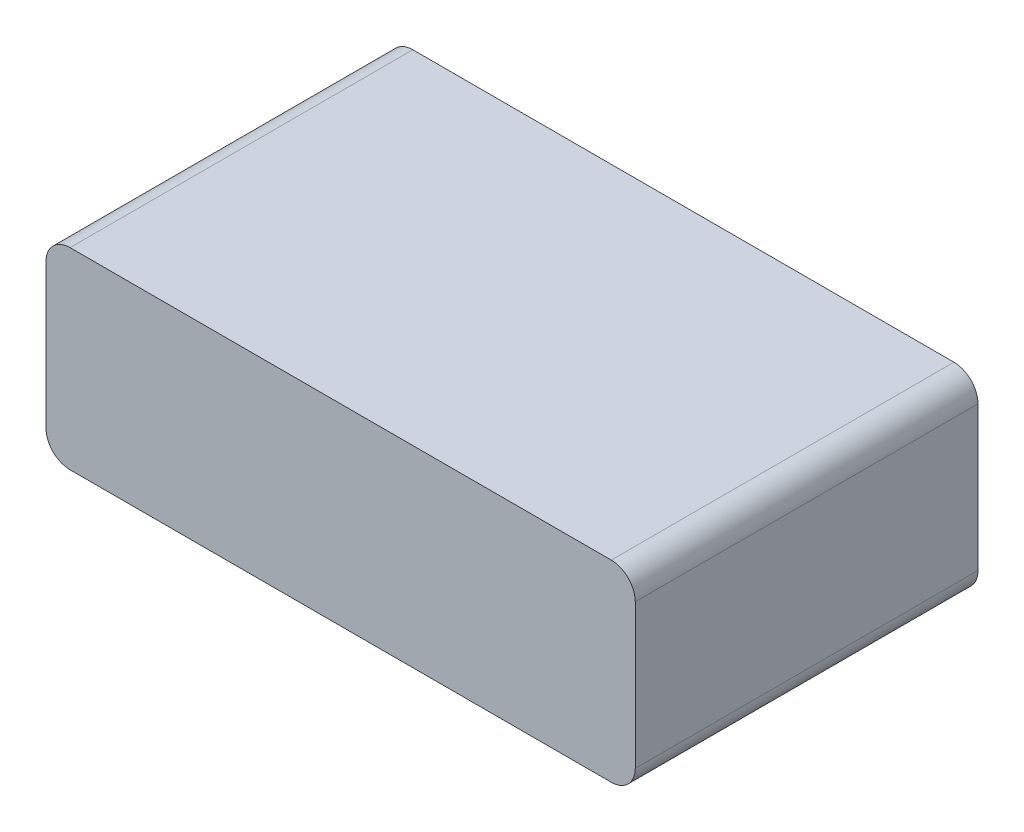
ISO-10303-21;
HEADER;
FILE_DESCRIPTION(('STEP AP214'),'2;1');
FILE_NAME('part.step','',(''),(''),'','','');
FILE_SCHEMA(('AUTOMOTIVE_DESIGN { 1 0 10303 214 1 1 1 1 }'));
ENDSEC;
DATA;
#1=APPLICATION_CONTEXT('core data for automotive mechanical design processes');
#2=APPLICATION_PROTOCOL_DEFINITION('international standard','automotive_design',2000,#1);
#3=PRODUCT_CONTEXT('',#1,'mechanical');
#4=PRODUCT('Part','Part','',(#3));
#5=PRODUCT_RELATED_PRODUCT_CATEGORY('part','',(#4));
#6=PRODUCT_DEFINITION_FORMATION('','',#4);
#7=PRODUCT_DEFINITION_CONTEXT('part definition',#1,'design');
#8=PRODUCT_DEFINITION('design','',#6,#7);
#9=PRODUCT_DEFINITION_SHAPE('','',#8);
#10=(LENGTH_UNIT() NAMED_UNIT(*) SI_UNIT(.MILLI.,.METRE.));
#11=(NAMED_UNIT(*) PLANE_ANGLE_UNIT() SI_UNIT($,.RADIAN.));
#12=(NAMED_UNIT(*) SI_UNIT($,.STERADIAN.) SOLID_ANGLE_UNIT());
#13=UNCERTAINTY_MEASURE_WITH_UNIT(LENGTH_MEASURE(1.E-05),#10,'distance_accuracy_value','');
#14=(GEOMETRIC_REPRESENTATION_CONTEXT(3) GLOBAL_UNCERTAINTY_ASSIGNED_CONTEXT((#13)) GLOBAL_UNIT_ASSIGNED_CONTEXT((#10,
#11,#12)) REPRESENTATION_CONTEXT('',''));
#15=CARTESIAN_POINT('',(0.,0.,0.));
#16=DIRECTION('',(0.,0.,1.));
#17=DIRECTION('',(1.,0.,0.));
#18=AXIS2_PLACEMENT_3D('',#15,#16,#17);
#19=CARTESIAN_POINT('',(0.,16.,0.));
#20=DIRECTION('',(1.,0.,0.));
#21=DIRECTION('',(0.,0.,-1.));
#22=AXIS2_PLACEMENT_3D('',#19,#20,#21);
#23=PLANE('',#22);
#24=DIRECTION('',(0.,-1.,0.));
#25=VECTOR('',#24,1.);
#26=CARTESIAN_POINT('',(0.,16.,-28.5));
#27=LINE('',#26,#25);
#28=CARTESIAN_POINT('',(0.,14.,-28.5));
#29=VERTEX_POINT('',#28);
#30=CARTESIAN_POINT('',(0.,2.,-28.5));
#31=VERTEX_POINT('',#30);
#32=EDGE_CURVE('E121',#29,#31,#27,.T.);
#33=ORIENTED_EDGE('',*,*,#32,.T.);
#34=DIRECTION('',(0.,0.,1.));
#35=VECTOR('',#34,1.);
#36=CARTESIAN_POINT('',(0.,2.,0.));
#37=LINE('',#36,#35);
#38=CARTESIAN_POINT('',(0.,2.,0.));
#39=VERTEX_POINT('',#38);
#40=EDGE_CURVE('E11',#31,#39,#37,.T.);
#41=ORIENTED_EDGE('',*,*,#40,.T.);
#42=DIRECTION('',(0.,-1.,0.));
#43=VECTOR('',#42,1.);
#44=CARTESIAN_POINT('',(0.,16.,0.));
#45=LINE('',#44,#43);
#46=CARTESIAN_POINT('',(0.,14.,0.));
#47=VERTEX_POINT('',#46);
#48=EDGE_CURVE('E126',#47,#39,#45,.T.);
#49=ORIENTED_EDGE('',*,*,#48,.F.);
#50=DIRECTION('',(0.,0.,1.));
#51=VECTOR('',#50,1.);
#52=CARTESIAN_POINT('',(0.,14.,0.));
#53=LINE('',#52,#51);
#54=EDGE_CURVE('E41',#47,#29,#53,.F.);
#55=ORIENTED_EDGE('',*,*,#54,.T.);
#56=EDGE_LOOP('',(#33,#41,#49,#55));
#57=FACE_BOUND('',#56,.T.);
#58=ADVANCED_FACE('F33',(#57),#23,.F.);
#59=CARTESIAN_POINT('',(0.,16.,0.));
#60=DIRECTION('',(0.,0.,-1.));
#61=DIRECTION('',(-1.,0.,0.));
#62=AXIS2_PLACEMENT_3D('',#59,#60,#61);
#63=PLANE('',#62);
#64=DIRECTION('',(1.,0.,0.));
#65=VECTOR('',#64,1.);
#66=CARTESIAN_POINT('',(0.,0.,0.));
#67=LINE('',#66,#65);
#68=CARTESIAN_POINT('',(2.,0.,0.));
#69=VERTEX_POINT('',#68);
#70=CARTESIAN_POINT('',(47.,0.,0.));
#71=VERTEX_POINT('',#70);
#72=EDGE_CURVE('E168',#69,#71,#67,.T.);
#73=ORIENTED_EDGE('',*,*,#72,.T.);
#74=CARTESIAN_POINT('',(47.,2.,0.));
#75=DIRECTION('',(0.,0.,-1.));
#76=DIRECTION('',(-1.,0.,0.));
#77=AXIS2_PLACEMENT_3D('',#74,#75,#76);
#78=CIRCLE('',#77,2.);
#79=CARTESIAN_POINT('',(49.,2.,0.));
#80=VERTEX_POINT('',#79);
#81=EDGE_CURVE('E143',#71,#80,#78,.F.);
#82=ORIENTED_EDGE('',*,*,#81,.T.);
#83=DIRECTION('',(0.,-1.,0.));
#84=VECTOR('',#83,1.);
#85=CARTESIAN_POINT('',(49.,16.,0.));
#86=LINE('',#85,#84);
#87=CARTESIAN_POINT('',(49.,14.,0.));
#88=VERTEX_POINT('',#87);
#89=EDGE_CURVE('E120',#88,#80,#86,.T.);
#90=ORIENTED_EDGE('',*,*,#89,.F.);
#91=CARTESIAN_POINT('',(47.,14.,0.));
#92=DIRECTION('',(0.,0.,-1.));
#93=DIRECTION('',(-1.,0.,0.));
#94=AXIS2_PLACEMENT_3D('',#91,#92,#93);
#95=CIRCLE('',#94,2.);
#96=CARTESIAN_POINT('',(47.,16.,0.));
#97=VERTEX_POINT('',#96);
#98=EDGE_CURVE('E125',#88,#97,#95,.F.);
#99=ORIENTED_EDGE('',*,*,#98,.T.);
#100=DIRECTION('',(1.,0.,0.));
#101=VECTOR('',#100,1.);
#102=CARTESIAN_POINT('',(0.,16.,0.));
#103=LINE('',#102,#101);
#104=CARTESIAN_POINT('',(2.,16.,0.));
#105=VERTEX_POINT('',#104);
#106=EDGE_CURVE('E162',#105,#97,#103,.T.);
#107=ORIENTED_EDGE('',*,*,#106,.F.);
#108=CARTESIAN_POINT('',(2.,14.,0.));
#109=DIRECTION('',(0.,0.,-1.));
#110=DIRECTION('',(-1.,0.,0.));
#111=AXIS2_PLACEMENT_3D('',#108,#109,#110);
#112=CIRCLE('',#111,2.);
#113=EDGE_CURVE('E55',#105,#47,#112,.F.);
#114=ORIENTED_EDGE('',*,*,#113,.T.);
#115=ORIENTED_EDGE('',*,*,#48,.T.);
#116=CARTESIAN_POINT('',(2.,2.,0.));
#117=DIRECTION('',(0.,0.,-1.));
#118=DIRECTION('',(-1.,0.,0.));
#119=AXIS2_PLACEMENT_3D('',#116,#117,#118);
#120=CIRCLE('',#119,2.);
#121=EDGE_CURVE('E48',#39,#69,#120,.F.);
#122=ORIENTED_EDGE('',*,*,#121,.T.);
#123=EDGE_LOOP('',(#73,#82,#90,#99,#107,#114,#115,#122));
#124=FACE_BOUND('',#123,.T.);
#125=ADVANCED_FACE('F164',(#124),#63,.F.);
#126=CARTESIAN_POINT('',(49.,16.,0.));
#127=DIRECTION('',(-1.,0.,0.));
#128=DIRECTION('',(0.,0.,1.));
#129=AXIS2_PLACEMENT_3D('',#126,#127,#128);
#130=PLANE('',#129);
#131=ORIENTED_EDGE('',*,*,#89,.T.);
#132=DIRECTION('',(0.,0.,-1.));
#133=VECTOR('',#132,1.);
#134=CARTESIAN_POINT('',(49.,2.,-28.5));
#135=LINE('',#134,#133);
#136=CARTESIAN_POINT('',(49.,2.,-28.5));
#137=VERTEX_POINT('',#136);
#138=EDGE_CURVE('E119',#80,#137,#135,.T.);
#139=ORIENTED_EDGE('',*,*,#138,.T.);
#140=DIRECTION('',(0.,-1.,0.));
#141=VECTOR('',#140,1.);
#142=CARTESIAN_POINT('',(49.,16.,-28.5));
#143=LINE('',#142,#141);
#144=CARTESIAN_POINT('',(49.,14.,-28.5));
#145=VERTEX_POINT('',#144);
#146=EDGE_CURVE('E102',#145,#137,#143,.T.);
#147=ORIENTED_EDGE('',*,*,#146,.F.);
#148=DIRECTION('',(0.,0.,-1.));
#149=VECTOR('',#148,1.);
#150=CARTESIAN_POINT('',(49.,14.,0.));
#151=LINE('',#150,#149);
#152=EDGE_CURVE('E116',#145,#88,#151,.F.);
#153=ORIENTED_EDGE('',*,*,#152,.T.);
#154=EDGE_LOOP('',(#131,#139,#147,#153));
#155=FACE_BOUND('',#154,.T.);
#156=ADVANCED_FACE('F115',(#155),#130,.F.);
#157=CARTESIAN_POINT('',(0.,16.,-28.5));
#158=DIRECTION('',(0.,0.,1.));
#159=DIRECTION('',(1.,0.,0.));
#160=AXIS2_PLACEMENT_3D('',#157,#158,#159);
#161=PLANE('',#160);
#162=ORIENTED_EDGE('',*,*,#146,.T.);
#163=CARTESIAN_POINT('',(47.,2.,-28.5));
#164=DIRECTION('',(0.,0.,1.));
#165=DIRECTION('',(1.,0.,0.));
#166=AXIS2_PLACEMENT_3D('',#163,#164,#165);
#167=CIRCLE('',#166,2.);
#168=CARTESIAN_POINT('',(47.,0.,-28.5));
#169=VERTEX_POINT('',#168);
#170=EDGE_CURVE('E109',#137,#169,#167,.F.);
#171=ORIENTED_EDGE('',*,*,#170,.T.);
#172=DIRECTION('',(-1.,0.,0.));
#173=VECTOR('',#172,1.);
#174=CARTESIAN_POINT('',(0.,0.,-28.5));
#175=LINE('',#174,#173);
#176=CARTESIAN_POINT('',(2.,0.,-28.5));
#177=VERTEX_POINT('',#176);
#178=EDGE_CURVE('E165',#169,#177,#175,.T.);
#179=ORIENTED_EDGE('',*,*,#178,.T.);
#180=CARTESIAN_POINT('',(2.,2.,-28.5));
#181=DIRECTION('',(0.,0.,1.));
#182=DIRECTION('',(1.,0.,0.));
#183=AXIS2_PLACEMENT_3D('',#180,#181,#182);
#184=CIRCLE('',#183,2.);
#185=EDGE_CURVE('E110',#177,#31,#184,.F.);
#186=ORIENTED_EDGE('',*,*,#185,.T.);
#187=ORIENTED_EDGE('',*,*,#32,.F.);
#188=CARTESIAN_POINT('',(2.,14.,-28.5));
#189=DIRECTION('',(0.,0.,1.));
#190=DIRECTION('',(1.,0.,0.));
#191=AXIS2_PLACEMENT_3D('',#188,#189,#190);
#192=CIRCLE('',#191,2.);
#193=CARTESIAN_POINT('',(2.,16.,-28.5));
#194=VERTEX_POINT('',#193);
#195=EDGE_CURVE('E128',#29,#194,#192,.F.);
#196=ORIENTED_EDGE('',*,*,#195,.T.);
#197=DIRECTION('',(-1.,0.,0.));
#198=VECTOR('',#197,1.);
#199=CARTESIAN_POINT('',(0.,16.,-28.5));
#200=LINE('',#199,#198);
#201=CARTESIAN_POINT('',(47.,16.,-28.5));
#202=VERTEX_POINT('',#201);
#203=EDGE_CURVE('E104',#202,#194,#200,.T.);
#204=ORIENTED_EDGE('',*,*,#203,.F.);
#205=CARTESIAN_POINT('',(47.,14.,-28.5));
#206=DIRECTION('',(0.,0.,1.));
#207=DIRECTION('',(1.,0.,0.));
#208=AXIS2_PLACEMENT_3D('',#205,#206,#207);
#209=CIRCLE('',#208,2.);
#210=EDGE_CURVE('E99',#202,#145,#209,.F.);
#211=ORIENTED_EDGE('',*,*,#210,.T.);
#212=EDGE_LOOP('',(#162,#171,#179,#186,#187,#196,#204,#211));
#213=FACE_BOUND('',#212,.T.);
#214=ADVANCED_FACE('F101',(#213),#161,.F.);
#215=CARTESIAN_POINT('',(0.,16.,0.));
#216=DIRECTION('',(0.,-1.,0.));
#217=DIRECTION('',(0.,0.,-1.));
#218=AXIS2_PLACEMENT_3D('',#215,#216,#217);
#219=PLANE('',#218);
#220=ORIENTED_EDGE('',*,*,#106,.T.);
#221=DIRECTION('',(0.,0.,-1.));
#222=VECTOR('',#221,1.);
#223=CARTESIAN_POINT('',(47.,16.,0.));
#224=LINE('',#223,#222);
#225=EDGE_CURVE('E148',#97,#202,#224,.T.);
#226=ORIENTED_EDGE('',*,*,#225,.T.);
#227=ORIENTED_EDGE('',*,*,#203,.T.);
#228=DIRECTION('',(0.,0.,1.));
#229=VECTOR('',#228,1.);
#230=CARTESIAN_POINT('',(2.,16.,0.));
#231=LINE('',#230,#229);
#232=EDGE_CURVE('E145',#194,#105,#231,.T.);
#233=ORIENTED_EDGE('',*,*,#232,.T.);
#234=EDGE_LOOP('',(#220,#226,#227,#233));
#235=FACE_BOUND('',#234,.T.);
#236=ADVANCED_FACE('F161',(#235),#219,.F.);
#237=CARTESIAN_POINT('',(0.,0.,0.));
#238=DIRECTION('',(0.,-1.,0.));
#239=DIRECTION('',(0.,0.,-1.));
#240=AXIS2_PLACEMENT_3D('',#237,#238,#239);
#241=PLANE('',#240);
#242=ORIENTED_EDGE('',*,*,#178,.F.);
#243=DIRECTION('',(0.,0.,-1.));
#244=VECTOR('',#243,1.);
#245=CARTESIAN_POINT('',(47.,0.,0.));
#246=LINE('',#245,#244);
#247=EDGE_CURVE('E138',#169,#71,#246,.F.);
#248=ORIENTED_EDGE('',*,*,#247,.T.);
#249=ORIENTED_EDGE('',*,*,#72,.F.);
#250=DIRECTION('',(0.,0.,1.));
#251=VECTOR('',#250,1.);
#252=CARTESIAN_POINT('',(2.,0.,-28.5));
#253=LINE('',#252,#251);
#254=EDGE_CURVE('E136',#69,#177,#253,.F.);
#255=ORIENTED_EDGE('',*,*,#254,.T.);
#256=EDGE_LOOP('',(#242,#248,#249,#255));
#257=FACE_BOUND('',#256,.T.);
#258=ADVANCED_FACE('F177',(#257),#241,.T.);
#259=CARTESIAN_POINT('',(47.,2.,0.));
#260=DIRECTION('',(0.,0.,1.));
#261=DIRECTION('',(1.,0.,0.));
#262=AXIS2_PLACEMENT_3D('',#259,#260,#261);
#263=CYLINDRICAL_SURFACE('',#262,2.);
#264=ORIENTED_EDGE('',*,*,#81,.F.);
#265=ORIENTED_EDGE('',*,*,#247,.F.);
#266=ORIENTED_EDGE('',*,*,#170,.F.);
#267=ORIENTED_EDGE('',*,*,#138,.F.);
#268=EDGE_LOOP('',(#264,#265,#266,#267));
#269=FACE_BOUND('',#268,.T.);
#270=ADVANCED_FACE('F173',(#269),#263,.T.);
#271=CARTESIAN_POINT('',(47.,14.,0.));
#272=DIRECTION('',(0.,0.,-1.));
#273=DIRECTION('',(-1.,0.,0.));
#274=AXIS2_PLACEMENT_3D('',#271,#272,#273);
#275=CYLINDRICAL_SURFACE('',#274,2.);
#276=ORIENTED_EDGE('',*,*,#98,.F.);
#277=ORIENTED_EDGE('',*,*,#152,.F.);
#278=ORIENTED_EDGE('',*,*,#210,.F.);
#279=ORIENTED_EDGE('',*,*,#225,.F.);
#280=EDGE_LOOP('',(#276,#277,#278,#279));
#281=FACE_BOUND('',#280,.T.);
#282=ADVANCED_FACE('F124',(#281),#275,.T.);
#283=CARTESIAN_POINT('',(2.,2.,0.));
#284=DIRECTION('',(0.,0.,-1.));
#285=DIRECTION('',(-1.,0.,0.));
#286=AXIS2_PLACEMENT_3D('',#283,#284,#285);
#287=CYLINDRICAL_SURFACE('',#286,2.);
#288=ORIENTED_EDGE('',*,*,#185,.F.);
#289=ORIENTED_EDGE('',*,*,#254,.F.);
#290=ORIENTED_EDGE('',*,*,#121,.F.);
#291=ORIENTED_EDGE('',*,*,#40,.F.);
#292=EDGE_LOOP('',(#288,#289,#290,#291));
#293=FACE_BOUND('',#292,.T.);
#294=ADVANCED_FACE('F179',(#293),#287,.T.);
#295=CARTESIAN_POINT('',(2.,14.,0.));
#296=DIRECTION('',(0.,0.,1.));
#297=DIRECTION('',(1.,0.,0.));
#298=AXIS2_PLACEMENT_3D('',#295,#296,#297);
#299=CYLINDRICAL_SURFACE('',#298,2.);
#300=ORIENTED_EDGE('',*,*,#195,.F.);
#301=ORIENTED_EDGE('',*,*,#54,.F.);
#302=ORIENTED_EDGE('',*,*,#113,.F.);
#303=ORIENTED_EDGE('',*,*,#232,.F.);
#304=EDGE_LOOP('',(#300,#301,#302,#303));
#305=FACE_BOUND('',#304,.T.);
#306=ADVANCED_FACE('F35',(#305),#299,.T.);
#307=CLOSED_SHELL('',(#58,#125,#156,#214,#236,#258,#270,#282,#294,#306));
#308=MANIFOLD_SOLID_BREP('B2',#307);
#309=ADVANCED_BREP_SHAPE_REPRESENTATION('',(#18,#308),#14);
#310=SHAPE_DEFINITION_REPRESENTATION(#9,#309);
ENDSEC;
END-ISO-10303-21;
